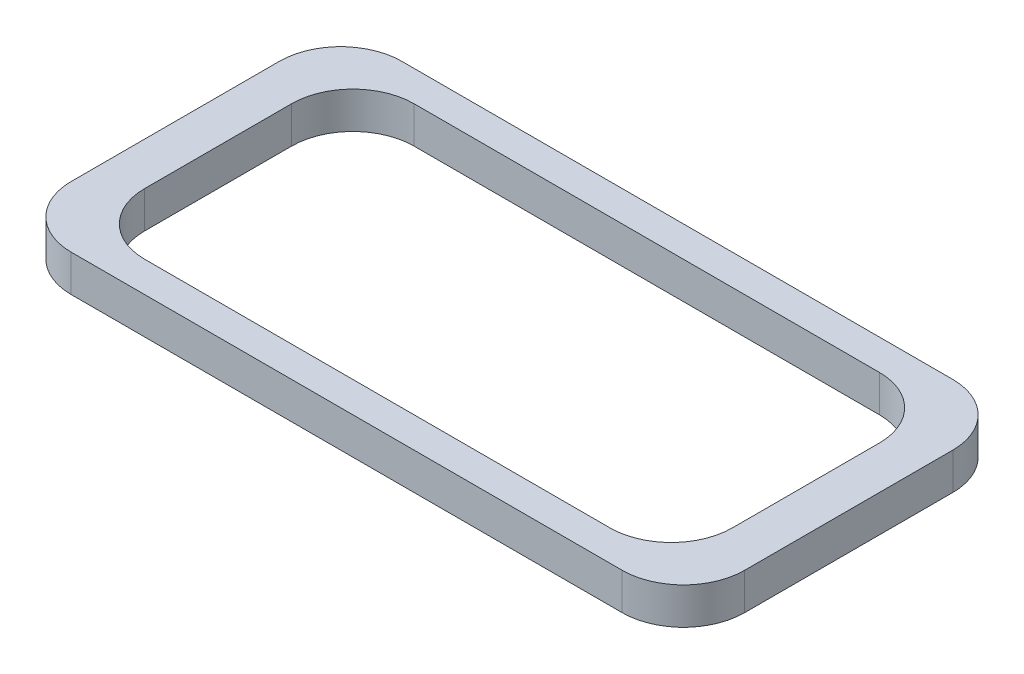
ISO-10303-21;
HEADER;
FILE_DESCRIPTION(('STEP AP214'),'2;1');
FILE_NAME('part.step','',(''),(''),'','','');
FILE_SCHEMA(('AUTOMOTIVE_DESIGN { 1 0 10303 214 1 1 1 1 }'));
ENDSEC;
DATA;
#1=APPLICATION_CONTEXT('core data for automotive mechanical design processes');
#2=APPLICATION_PROTOCOL_DEFINITION('international standard','automotive_design',2000,#1);
#3=PRODUCT_CONTEXT('',#1,'mechanical');
#4=PRODUCT('Part','Part','',(#3));
#5=PRODUCT_RELATED_PRODUCT_CATEGORY('part','',(#4));
#6=PRODUCT_DEFINITION_FORMATION('','',#4);
#7=PRODUCT_DEFINITION_CONTEXT('part definition',#1,'design');
#8=PRODUCT_DEFINITION('design','',#6,#7);
#9=PRODUCT_DEFINITION_SHAPE('','',#8);
#10=(LENGTH_UNIT() NAMED_UNIT(*) SI_UNIT(.MILLI.,.METRE.));
#11=(NAMED_UNIT(*) PLANE_ANGLE_UNIT() SI_UNIT($,.RADIAN.));
#12=(NAMED_UNIT(*) SI_UNIT($,.STERADIAN.) SOLID_ANGLE_UNIT());
#13=UNCERTAINTY_MEASURE_WITH_UNIT(LENGTH_MEASURE(1.E-05),#10,'distance_accuracy_value','');
#14=(GEOMETRIC_REPRESENTATION_CONTEXT(3) GLOBAL_UNCERTAINTY_ASSIGNED_CONTEXT((#13)) GLOBAL_UNIT_ASSIGNED_CONTEXT((#10,
#11,#12)) REPRESENTATION_CONTEXT('',''));
#15=CARTESIAN_POINT('',(0.,0.,0.));
#16=DIRECTION('',(0.,0.,1.));
#17=DIRECTION('',(1.,0.,0.));
#18=AXIS2_PLACEMENT_3D('',#15,#16,#17);
#19=CARTESIAN_POINT('',(22.5,3.,8.5));
#20=DIRECTION('',(0.,1.,0.));
#21=DIRECTION('',(0.,0.,1.));
#22=AXIS2_PLACEMENT_3D('',#19,#20,#21);
#23=PLANE('',#22);
#24=CARTESIAN_POINT('',(22.5,3.,8.5));
#25=DIRECTION('',(0.,1.,0.));
#26=DIRECTION('',(0.,0.,1.));
#27=AXIS2_PLACEMENT_3D('',#24,#25,#26);
#28=CIRCLE('',#27,5.);
#29=CARTESIAN_POINT('',(22.5,3.,13.5));
#30=VERTEX_POINT('',#29);
#31=CARTESIAN_POINT('',(27.5,3.,8.5));
#32=VERTEX_POINT('',#31);
#33=EDGE_CURVE('E215',#30,#32,#28,.T.);
#34=ORIENTED_EDGE('',*,*,#33,.T.);
#35=DIRECTION('',(0.,0.,-1.));
#36=VECTOR('',#35,1.);
#37=CARTESIAN_POINT('',(27.5,3.,-8.5));
#38=LINE('',#37,#36);
#39=CARTESIAN_POINT('',(27.5,3.,-8.5));
#40=VERTEX_POINT('',#39);
#41=EDGE_CURVE('E218',#32,#40,#38,.T.);
#42=ORIENTED_EDGE('',*,*,#41,.T.);
#43=CARTESIAN_POINT('',(22.5,3.,-8.5));
#44=DIRECTION('',(0.,1.,0.));
#45=DIRECTION('',(0.,0.,-1.));
#46=AXIS2_PLACEMENT_3D('',#43,#44,#45);
#47=CIRCLE('',#46,5.);
#48=CARTESIAN_POINT('',(22.5,3.,-13.5));
#49=VERTEX_POINT('',#48);
#50=EDGE_CURVE('E221',#40,#49,#47,.T.);
#51=ORIENTED_EDGE('',*,*,#50,.T.);
#52=DIRECTION('',(-1.,0.,0.));
#53=VECTOR('',#52,1.);
#54=CARTESIAN_POINT('',(-22.5,3.,-13.5));
#55=LINE('',#54,#53);
#56=CARTESIAN_POINT('',(-22.5,3.,-13.5));
#57=VERTEX_POINT('',#56);
#58=EDGE_CURVE('E223',#49,#57,#55,.T.);
#59=ORIENTED_EDGE('',*,*,#58,.T.);
#60=CARTESIAN_POINT('',(-22.5,3.,-8.5));
#61=DIRECTION('',(0.,1.,0.));
#62=DIRECTION('',(0.,0.,1.));
#63=AXIS2_PLACEMENT_3D('',#60,#61,#62);
#64=CIRCLE('',#63,5.);
#65=CARTESIAN_POINT('',(-27.5,3.,-8.5));
#66=VERTEX_POINT('',#65);
#67=EDGE_CURVE('E225',#57,#66,#64,.T.);
#68=ORIENTED_EDGE('',*,*,#67,.T.);
#69=DIRECTION('',(0.,0.,1.));
#70=VECTOR('',#69,1.);
#71=CARTESIAN_POINT('',(-27.5,3.,-8.5));
#72=LINE('',#71,#70);
#73=CARTESIAN_POINT('',(-27.5,3.,8.5));
#74=VERTEX_POINT('',#73);
#75=EDGE_CURVE('E227',#66,#74,#72,.T.);
#76=ORIENTED_EDGE('',*,*,#75,.T.);
#77=CARTESIAN_POINT('',(-22.5,3.,8.5));
#78=DIRECTION('',(0.,1.,0.));
#79=DIRECTION('',(0.,0.,1.));
#80=AXIS2_PLACEMENT_3D('',#77,#78,#79);
#81=CIRCLE('',#80,5.);
#82=CARTESIAN_POINT('',(-22.5,3.,13.5));
#83=VERTEX_POINT('',#82);
#84=EDGE_CURVE('E229',#74,#83,#81,.T.);
#85=ORIENTED_EDGE('',*,*,#84,.T.);
#86=DIRECTION('',(1.,0.,0.));
#87=VECTOR('',#86,1.);
#88=CARTESIAN_POINT('',(-22.5,3.,13.5));
#89=LINE('',#88,#87);
#90=EDGE_CURVE('E231',#83,#30,#89,.T.);
#91=ORIENTED_EDGE('',*,*,#90,.T.);
#92=EDGE_LOOP('',(#34,#42,#51,#59,#68,#76,#85,#91));
#93=FACE_BOUND('',#92,.T.);
#94=DIRECTION('',(1.,0.,0.));
#95=VECTOR('',#94,1.);
#96=CARTESIAN_POINT('',(-19.,3.,11.));
#97=LINE('',#96,#95);
#98=CARTESIAN_POINT('',(-19.,3.,11.));
#99=VERTEX_POINT('',#98);
#100=CARTESIAN_POINT('',(19.,3.,11.));
#101=VERTEX_POINT('',#100);
#102=EDGE_CURVE('E158',#99,#101,#97,.T.);
#103=ORIENTED_EDGE('',*,*,#102,.F.);
#104=CARTESIAN_POINT('',(-19.,3.,6.));
#105=DIRECTION('',(0.,1.,0.));
#106=DIRECTION('',(0.,0.,-1.));
#107=AXIS2_PLACEMENT_3D('',#104,#105,#106);
#108=CIRCLE('',#107,5.);
#109=CARTESIAN_POINT('',(-24.,3.,6.));
#110=VERTEX_POINT('',#109);
#111=EDGE_CURVE('E150',#110,#99,#108,.T.);
#112=ORIENTED_EDGE('',*,*,#111,.F.);
#113=DIRECTION('',(0.,0.,1.));
#114=VECTOR('',#113,1.);
#115=CARTESIAN_POINT('',(-24.,3.,6.));
#116=LINE('',#115,#114);
#117=CARTESIAN_POINT('',(-24.,3.,-6.));
#118=VERTEX_POINT('',#117);
#119=EDGE_CURVE('E183',#118,#110,#116,.T.);
#120=ORIENTED_EDGE('',*,*,#119,.F.);
#121=CARTESIAN_POINT('',(-19.,3.,-6.));
#122=DIRECTION('',(0.,1.,0.));
#123=DIRECTION('',(0.,0.,-1.));
#124=AXIS2_PLACEMENT_3D('',#121,#122,#123);
#125=CIRCLE('',#124,5.);
#126=CARTESIAN_POINT('',(-19.,3.,-11.));
#127=VERTEX_POINT('',#126);
#128=EDGE_CURVE('E181',#127,#118,#125,.T.);
#129=ORIENTED_EDGE('',*,*,#128,.F.);
#130=DIRECTION('',(-1.,0.,0.));
#131=VECTOR('',#130,1.);
#132=CARTESIAN_POINT('',(-19.,3.,-11.));
#133=LINE('',#132,#131);
#134=CARTESIAN_POINT('',(19.,3.,-11.));
#135=VERTEX_POINT('',#134);
#136=EDGE_CURVE('E179',#135,#127,#133,.T.);
#137=ORIENTED_EDGE('',*,*,#136,.F.);
#138=CARTESIAN_POINT('',(19.,3.,-6.));
#139=DIRECTION('',(0.,1.,0.));
#140=DIRECTION('',(0.,0.,-1.));
#141=AXIS2_PLACEMENT_3D('',#138,#139,#140);
#142=CIRCLE('',#141,5.);
#143=CARTESIAN_POINT('',(24.,3.,-6.));
#144=VERTEX_POINT('',#143);
#145=EDGE_CURVE('E177',#144,#135,#142,.T.);
#146=ORIENTED_EDGE('',*,*,#145,.F.);
#147=DIRECTION('',(0.,0.,-1.));
#148=VECTOR('',#147,1.);
#149=CARTESIAN_POINT('',(24.,3.,6.));
#150=LINE('',#149,#148);
#151=CARTESIAN_POINT('',(24.,3.,6.));
#152=VERTEX_POINT('',#151);
#153=EDGE_CURVE('E173',#152,#144,#150,.T.);
#154=ORIENTED_EDGE('',*,*,#153,.F.);
#155=CARTESIAN_POINT('',(19.,3.,6.));
#156=DIRECTION('',(0.,1.,0.));
#157=DIRECTION('',(0.,0.,1.));
#158=AXIS2_PLACEMENT_3D('',#155,#156,#157);
#159=CIRCLE('',#158,5.);
#160=EDGE_CURVE('E171',#101,#152,#159,.T.);
#161=ORIENTED_EDGE('',*,*,#160,.F.);
#162=EDGE_LOOP('',(#103,#112,#120,#129,#137,#146,#154,#161));
#163=FACE_BOUND('',#162,.T.);
#164=ADVANCED_FACE('F37',(#93,#163),#23,.T.);
#165=CARTESIAN_POINT('',(22.5,0.,8.5));
#166=DIRECTION('',(0.,1.,0.));
#167=DIRECTION('',(0.,0.,1.));
#168=AXIS2_PLACEMENT_3D('',#165,#166,#167);
#169=PLANE('',#168);
#170=CARTESIAN_POINT('',(22.5,0.,8.5));
#171=DIRECTION('',(0.,1.,0.));
#172=DIRECTION('',(0.,0.,1.));
#173=AXIS2_PLACEMENT_3D('',#170,#171,#172);
#174=CIRCLE('',#173,5.);
#175=CARTESIAN_POINT('',(22.5,0.,13.5));
#176=VERTEX_POINT('',#175);
#177=CARTESIAN_POINT('',(27.5,0.,8.5));
#178=VERTEX_POINT('',#177);
#179=EDGE_CURVE('E166',#176,#178,#174,.T.);
#180=ORIENTED_EDGE('',*,*,#179,.F.);
#181=DIRECTION('',(1.,0.,0.));
#182=VECTOR('',#181,1.);
#183=CARTESIAN_POINT('',(-22.5,0.,13.5));
#184=LINE('',#183,#182);
#185=CARTESIAN_POINT('',(-22.5,0.,13.5));
#186=VERTEX_POINT('',#185);
#187=EDGE_CURVE('E219',#186,#176,#184,.T.);
#188=ORIENTED_EDGE('',*,*,#187,.F.);
#189=CARTESIAN_POINT('',(-22.5,0.,8.5));
#190=DIRECTION('',(0.,1.,0.));
#191=DIRECTION('',(0.,0.,1.));
#192=AXIS2_PLACEMENT_3D('',#189,#190,#191);
#193=CIRCLE('',#192,5.);
#194=CARTESIAN_POINT('',(-27.5,0.,8.5));
#195=VERTEX_POINT('',#194);
#196=EDGE_CURVE('E246',#195,#186,#193,.T.);
#197=ORIENTED_EDGE('',*,*,#196,.F.);
#198=DIRECTION('',(0.,0.,1.));
#199=VECTOR('',#198,1.);
#200=CARTESIAN_POINT('',(-27.5,0.,-8.5));
#201=LINE('',#200,#199);
#202=CARTESIAN_POINT('',(-27.5,0.,-8.5));
#203=VERTEX_POINT('',#202);
#204=EDGE_CURVE('E244',#203,#195,#201,.T.);
#205=ORIENTED_EDGE('',*,*,#204,.F.);
#206=CARTESIAN_POINT('',(-22.5,0.,-8.5));
#207=DIRECTION('',(0.,1.,0.));
#208=DIRECTION('',(0.,0.,1.));
#209=AXIS2_PLACEMENT_3D('',#206,#207,#208);
#210=CIRCLE('',#209,5.);
#211=CARTESIAN_POINT('',(-22.5,0.,-13.5));
#212=VERTEX_POINT('',#211);
#213=EDGE_CURVE('E242',#212,#203,#210,.T.);
#214=ORIENTED_EDGE('',*,*,#213,.F.);
#215=DIRECTION('',(-1.,0.,0.));
#216=VECTOR('',#215,1.);
#217=CARTESIAN_POINT('',(-22.5,0.,-13.5));
#218=LINE('',#217,#216);
#219=CARTESIAN_POINT('',(22.5,0.,-13.5));
#220=VERTEX_POINT('',#219);
#221=EDGE_CURVE('E240',#220,#212,#218,.T.);
#222=ORIENTED_EDGE('',*,*,#221,.F.);
#223=CARTESIAN_POINT('',(22.5,0.,-8.5));
#224=DIRECTION('',(0.,1.,0.));
#225=DIRECTION('',(0.,0.,-1.));
#226=AXIS2_PLACEMENT_3D('',#223,#224,#225);
#227=CIRCLE('',#226,5.);
#228=CARTESIAN_POINT('',(27.5,0.,-8.5));
#229=VERTEX_POINT('',#228);
#230=EDGE_CURVE('E238',#229,#220,#227,.T.);
#231=ORIENTED_EDGE('',*,*,#230,.F.);
#232=DIRECTION('',(0.,0.,-1.));
#233=VECTOR('',#232,1.);
#234=CARTESIAN_POINT('',(27.5,0.,-8.5));
#235=LINE('',#234,#233);
#236=EDGE_CURVE('E236',#178,#229,#235,.T.);
#237=ORIENTED_EDGE('',*,*,#236,.F.);
#238=EDGE_LOOP('',(#180,#188,#197,#205,#214,#222,#231,#237));
#239=FACE_BOUND('',#238,.T.);
#240=CARTESIAN_POINT('',(-19.,0.,6.));
#241=DIRECTION('',(0.,1.,0.));
#242=DIRECTION('',(0.,0.,-1.));
#243=AXIS2_PLACEMENT_3D('',#240,#241,#242);
#244=CIRCLE('',#243,5.);
#245=CARTESIAN_POINT('',(-24.,0.,6.));
#246=VERTEX_POINT('',#245);
#247=CARTESIAN_POINT('',(-19.,0.,11.));
#248=VERTEX_POINT('',#247);
#249=EDGE_CURVE('E60',#246,#248,#244,.T.);
#250=ORIENTED_EDGE('',*,*,#249,.T.);
#251=DIRECTION('',(1.,0.,0.));
#252=VECTOR('',#251,1.);
#253=CARTESIAN_POINT('',(-19.,0.,11.));
#254=LINE('',#253,#252);
#255=CARTESIAN_POINT('',(19.,0.,11.));
#256=VERTEX_POINT('',#255);
#257=EDGE_CURVE('E165',#248,#256,#254,.T.);
#258=ORIENTED_EDGE('',*,*,#257,.T.);
#259=CARTESIAN_POINT('',(19.,0.,6.));
#260=DIRECTION('',(0.,1.,0.));
#261=DIRECTION('',(0.,0.,1.));
#262=AXIS2_PLACEMENT_3D('',#259,#260,#261);
#263=CIRCLE('',#262,5.);
#264=CARTESIAN_POINT('',(24.,0.,6.));
#265=VERTEX_POINT('',#264);
#266=EDGE_CURVE('E187',#256,#265,#263,.T.);
#267=ORIENTED_EDGE('',*,*,#266,.T.);
#268=DIRECTION('',(0.,0.,-1.));
#269=VECTOR('',#268,1.);
#270=CARTESIAN_POINT('',(24.,0.,6.));
#271=LINE('',#270,#269);
#272=CARTESIAN_POINT('',(24.,0.,-6.));
#273=VERTEX_POINT('',#272);
#274=EDGE_CURVE('E190',#265,#273,#271,.T.);
#275=ORIENTED_EDGE('',*,*,#274,.T.);
#276=CARTESIAN_POINT('',(19.,0.,-6.));
#277=DIRECTION('',(0.,1.,0.));
#278=DIRECTION('',(0.,0.,-1.));
#279=AXIS2_PLACEMENT_3D('',#276,#277,#278);
#280=CIRCLE('',#279,5.);
#281=CARTESIAN_POINT('',(19.,0.,-11.));
#282=VERTEX_POINT('',#281);
#283=EDGE_CURVE('E193',#273,#282,#280,.T.);
#284=ORIENTED_EDGE('',*,*,#283,.T.);
#285=DIRECTION('',(-1.,0.,0.));
#286=VECTOR('',#285,1.);
#287=CARTESIAN_POINT('',(-19.,0.,-11.));
#288=LINE('',#287,#286);
#289=CARTESIAN_POINT('',(-19.,0.,-11.));
#290=VERTEX_POINT('',#289);
#291=EDGE_CURVE('E196',#282,#290,#288,.T.);
#292=ORIENTED_EDGE('',*,*,#291,.T.);
#293=CARTESIAN_POINT('',(-19.,0.,-6.));
#294=DIRECTION('',(0.,1.,0.));
#295=DIRECTION('',(0.,0.,-1.));
#296=AXIS2_PLACEMENT_3D('',#293,#294,#295);
#297=CIRCLE('',#296,5.);
#298=CARTESIAN_POINT('',(-24.,0.,-6.));
#299=VERTEX_POINT('',#298);
#300=EDGE_CURVE('E199',#290,#299,#297,.T.);
#301=ORIENTED_EDGE('',*,*,#300,.T.);
#302=DIRECTION('',(0.,0.,1.));
#303=VECTOR('',#302,1.);
#304=CARTESIAN_POINT('',(-24.,0.,6.));
#305=LINE('',#304,#303);
#306=EDGE_CURVE('E159',#299,#246,#305,.T.);
#307=ORIENTED_EDGE('',*,*,#306,.T.);
#308=EDGE_LOOP('',(#250,#258,#267,#275,#284,#292,#301,#307));
#309=FACE_BOUND('',#308,.T.);
#310=ADVANCED_FACE('F276',(#239,#309),#169,.F.);
#311=CARTESIAN_POINT('',(22.5,3.,8.5));
#312=DIRECTION('',(0.,-1.,0.));
#313=DIRECTION('',(0.,0.,-1.));
#314=AXIS2_PLACEMENT_3D('',#311,#312,#313);
#315=CYLINDRICAL_SURFACE('',#314,5.);
#316=ORIENTED_EDGE('',*,*,#179,.T.);
#317=DIRECTION('',(0.,-1.,0.));
#318=VECTOR('',#317,1.);
#319=CARTESIAN_POINT('',(27.5,3.,8.5));
#320=LINE('',#319,#318);
#321=EDGE_CURVE('E11',#32,#178,#320,.T.);
#322=ORIENTED_EDGE('',*,*,#321,.F.);
#323=ORIENTED_EDGE('',*,*,#33,.F.);
#324=DIRECTION('',(0.,-1.,0.));
#325=VECTOR('',#324,1.);
#326=CARTESIAN_POINT('',(22.5,3.,13.5));
#327=LINE('',#326,#325);
#328=EDGE_CURVE('E233',#30,#176,#327,.T.);
#329=ORIENTED_EDGE('',*,*,#328,.T.);
#330=EDGE_LOOP('',(#316,#322,#323,#329));
#331=FACE_BOUND('',#330,.T.);
#332=ADVANCED_FACE('F39',(#331),#315,.T.);
#333=CARTESIAN_POINT('',(27.5,3.,-8.5));
#334=DIRECTION('',(-1.,0.,0.));
#335=DIRECTION('',(0.,0.,1.));
#336=AXIS2_PLACEMENT_3D('',#333,#334,#335);
#337=PLANE('',#336);
#338=ORIENTED_EDGE('',*,*,#236,.T.);
#339=DIRECTION('',(0.,-1.,0.));
#340=VECTOR('',#339,1.);
#341=CARTESIAN_POINT('',(27.5,3.,-8.5));
#342=LINE('',#341,#340);
#343=EDGE_CURVE('E45',#40,#229,#342,.T.);
#344=ORIENTED_EDGE('',*,*,#343,.F.);
#345=ORIENTED_EDGE('',*,*,#41,.F.);
#346=ORIENTED_EDGE('',*,*,#321,.T.);
#347=EDGE_LOOP('',(#338,#344,#345,#346));
#348=FACE_BOUND('',#347,.T.);
#349=ADVANCED_FACE('F293',(#348),#337,.F.);
#350=CARTESIAN_POINT('',(22.5,3.,-8.5));
#351=DIRECTION('',(0.,-1.,0.));
#352=DIRECTION('',(0.,0.,-1.));
#353=AXIS2_PLACEMENT_3D('',#350,#351,#352);
#354=CYLINDRICAL_SURFACE('',#353,5.);
#355=ORIENTED_EDGE('',*,*,#230,.T.);
#356=DIRECTION('',(0.,-1.,0.));
#357=VECTOR('',#356,1.);
#358=CARTESIAN_POINT('',(22.5,3.,-13.5));
#359=LINE('',#358,#357);
#360=EDGE_CURVE('E263',#49,#220,#359,.T.);
#361=ORIENTED_EDGE('',*,*,#360,.F.);
#362=ORIENTED_EDGE('',*,*,#50,.F.);
#363=ORIENTED_EDGE('',*,*,#343,.T.);
#364=EDGE_LOOP('',(#355,#361,#362,#363));
#365=FACE_BOUND('',#364,.T.);
#366=ADVANCED_FACE('F270',(#365),#354,.T.);
#367=CARTESIAN_POINT('',(-22.5,3.,-13.5));
#368=DIRECTION('',(0.,0.,1.));
#369=DIRECTION('',(1.,0.,0.));
#370=AXIS2_PLACEMENT_3D('',#367,#368,#369);
#371=PLANE('',#370);
#372=ORIENTED_EDGE('',*,*,#221,.T.);
#373=DIRECTION('',(0.,-1.,0.));
#374=VECTOR('',#373,1.);
#375=CARTESIAN_POINT('',(-22.5,3.,-13.5));
#376=LINE('',#375,#374);
#377=EDGE_CURVE('E260',#57,#212,#376,.T.);
#378=ORIENTED_EDGE('',*,*,#377,.F.);
#379=ORIENTED_EDGE('',*,*,#58,.F.);
#380=ORIENTED_EDGE('',*,*,#360,.T.);
#381=EDGE_LOOP('',(#372,#378,#379,#380));
#382=FACE_BOUND('',#381,.T.);
#383=ADVANCED_FACE('F282',(#382),#371,.F.);
#384=CARTESIAN_POINT('',(-22.5,3.,-8.5));
#385=DIRECTION('',(0.,-1.,0.));
#386=DIRECTION('',(0.,0.,-1.));
#387=AXIS2_PLACEMENT_3D('',#384,#385,#386);
#388=CYLINDRICAL_SURFACE('',#387,5.);
#389=ORIENTED_EDGE('',*,*,#213,.T.);
#390=DIRECTION('',(0.,-1.,0.));
#391=VECTOR('',#390,1.);
#392=CARTESIAN_POINT('',(-27.5,3.,-8.5));
#393=LINE('',#392,#391);
#394=EDGE_CURVE('E257',#66,#203,#393,.T.);
#395=ORIENTED_EDGE('',*,*,#394,.F.);
#396=ORIENTED_EDGE('',*,*,#67,.F.);
#397=ORIENTED_EDGE('',*,*,#377,.T.);
#398=EDGE_LOOP('',(#389,#395,#396,#397));
#399=FACE_BOUND('',#398,.T.);
#400=ADVANCED_FACE('F286',(#399),#388,.T.);
#401=CARTESIAN_POINT('',(-27.5,3.,-8.5));
#402=DIRECTION('',(1.,0.,0.));
#403=DIRECTION('',(0.,0.,-1.));
#404=AXIS2_PLACEMENT_3D('',#401,#402,#403);
#405=PLANE('',#404);
#406=ORIENTED_EDGE('',*,*,#204,.T.);
#407=DIRECTION('',(0.,-1.,0.));
#408=VECTOR('',#407,1.);
#409=CARTESIAN_POINT('',(-27.5,3.,8.5));
#410=LINE('',#409,#408);
#411=EDGE_CURVE('E254',#74,#195,#410,.T.);
#412=ORIENTED_EDGE('',*,*,#411,.F.);
#413=ORIENTED_EDGE('',*,*,#75,.F.);
#414=ORIENTED_EDGE('',*,*,#394,.T.);
#415=EDGE_LOOP('',(#406,#412,#413,#414));
#416=FACE_BOUND('',#415,.T.);
#417=ADVANCED_FACE('F306',(#416),#405,.F.);
#418=CARTESIAN_POINT('',(-22.5,3.,8.5));
#419=DIRECTION('',(0.,-1.,0.));
#420=DIRECTION('',(0.,0.,-1.));
#421=AXIS2_PLACEMENT_3D('',#418,#419,#420);
#422=CYLINDRICAL_SURFACE('',#421,5.);
#423=ORIENTED_EDGE('',*,*,#196,.T.);
#424=DIRECTION('',(0.,-1.,0.));
#425=VECTOR('',#424,1.);
#426=CARTESIAN_POINT('',(-22.5,3.,13.5));
#427=LINE('',#426,#425);
#428=EDGE_CURVE('E251',#83,#186,#427,.T.);
#429=ORIENTED_EDGE('',*,*,#428,.F.);
#430=ORIENTED_EDGE('',*,*,#84,.F.);
#431=ORIENTED_EDGE('',*,*,#411,.T.);
#432=EDGE_LOOP('',(#423,#429,#430,#431));
#433=FACE_BOUND('',#432,.T.);
#434=ADVANCED_FACE('F304',(#433),#422,.T.);
#435=CARTESIAN_POINT('',(-22.5,3.,13.5));
#436=DIRECTION('',(0.,0.,-1.));
#437=DIRECTION('',(-1.,0.,0.));
#438=AXIS2_PLACEMENT_3D('',#435,#436,#437);
#439=PLANE('',#438);
#440=ORIENTED_EDGE('',*,*,#187,.T.);
#441=ORIENTED_EDGE('',*,*,#328,.F.);
#442=ORIENTED_EDGE('',*,*,#90,.F.);
#443=ORIENTED_EDGE('',*,*,#428,.T.);
#444=EDGE_LOOP('',(#440,#441,#442,#443));
#445=FACE_BOUND('',#444,.T.);
#446=ADVANCED_FACE('F299',(#445),#439,.F.);
#447=CARTESIAN_POINT('',(-19.,3.,6.));
#448=DIRECTION('',(0.,-1.,0.));
#449=DIRECTION('',(0.,0.,-1.));
#450=AXIS2_PLACEMENT_3D('',#447,#448,#449);
#451=CYLINDRICAL_SURFACE('',#450,5.);
#452=ORIENTED_EDGE('',*,*,#249,.F.);
#453=DIRECTION('',(0.,-1.,0.));
#454=VECTOR('',#453,1.);
#455=CARTESIAN_POINT('',(-24.,3.,6.));
#456=LINE('',#455,#454);
#457=EDGE_CURVE('E154',#110,#246,#456,.T.);
#458=ORIENTED_EDGE('',*,*,#457,.F.);
#459=ORIENTED_EDGE('',*,*,#111,.T.);
#460=DIRECTION('',(0.,-1.,0.));
#461=VECTOR('',#460,1.);
#462=CARTESIAN_POINT('',(-19.,3.,11.));
#463=LINE('',#462,#461);
#464=EDGE_CURVE('E153',#99,#248,#463,.T.);
#465=ORIENTED_EDGE('',*,*,#464,.T.);
#466=EDGE_LOOP('',(#452,#458,#459,#465));
#467=FACE_BOUND('',#466,.T.);
#468=ADVANCED_FACE('F152',(#467),#451,.F.);
#469=CARTESIAN_POINT('',(-19.,3.,11.));
#470=DIRECTION('',(0.,0.,-1.));
#471=DIRECTION('',(-1.,0.,0.));
#472=AXIS2_PLACEMENT_3D('',#469,#470,#471);
#473=PLANE('',#472);
#474=ORIENTED_EDGE('',*,*,#257,.F.);
#475=ORIENTED_EDGE('',*,*,#464,.F.);
#476=ORIENTED_EDGE('',*,*,#102,.T.);
#477=DIRECTION('',(0.,-1.,0.));
#478=VECTOR('',#477,1.);
#479=CARTESIAN_POINT('',(19.,3.,11.));
#480=LINE('',#479,#478);
#481=EDGE_CURVE('E167',#101,#256,#480,.T.);
#482=ORIENTED_EDGE('',*,*,#481,.T.);
#483=EDGE_LOOP('',(#474,#475,#476,#482));
#484=FACE_BOUND('',#483,.T.);
#485=ADVANCED_FACE('F162',(#484),#473,.T.);
#486=CARTESIAN_POINT('',(19.,3.,6.));
#487=DIRECTION('',(0.,-1.,0.));
#488=DIRECTION('',(0.,0.,-1.));
#489=AXIS2_PLACEMENT_3D('',#486,#487,#488);
#490=CYLINDRICAL_SURFACE('',#489,5.);
#491=ORIENTED_EDGE('',*,*,#266,.F.);
#492=ORIENTED_EDGE('',*,*,#481,.F.);
#493=ORIENTED_EDGE('',*,*,#160,.T.);
#494=DIRECTION('',(0.,-1.,0.));
#495=VECTOR('',#494,1.);
#496=CARTESIAN_POINT('',(24.,3.,6.));
#497=LINE('',#496,#495);
#498=EDGE_CURVE('E212',#152,#265,#497,.T.);
#499=ORIENTED_EDGE('',*,*,#498,.T.);
#500=EDGE_LOOP('',(#491,#492,#493,#499));
#501=FACE_BOUND('',#500,.T.);
#502=ADVANCED_FACE('F331',(#501),#490,.F.);
#503=CARTESIAN_POINT('',(24.,3.,6.));
#504=DIRECTION('',(-1.,0.,0.));
#505=DIRECTION('',(0.,0.,1.));
#506=AXIS2_PLACEMENT_3D('',#503,#504,#505);
#507=PLANE('',#506);
#508=ORIENTED_EDGE('',*,*,#274,.F.);
#509=ORIENTED_EDGE('',*,*,#498,.F.);
#510=ORIENTED_EDGE('',*,*,#153,.T.);
#511=DIRECTION('',(0.,-1.,0.));
#512=VECTOR('',#511,1.);
#513=CARTESIAN_POINT('',(24.,3.,-6.));
#514=LINE('',#513,#512);
#515=EDGE_CURVE('E210',#144,#273,#514,.T.);
#516=ORIENTED_EDGE('',*,*,#515,.T.);
#517=EDGE_LOOP('',(#508,#509,#510,#516));
#518=FACE_BOUND('',#517,.T.);
#519=ADVANCED_FACE('F335',(#518),#507,.T.);
#520=CARTESIAN_POINT('',(19.,3.,-6.));
#521=DIRECTION('',(0.,-1.,0.));
#522=DIRECTION('',(0.,0.,-1.));
#523=AXIS2_PLACEMENT_3D('',#520,#521,#522);
#524=CYLINDRICAL_SURFACE('',#523,5.);
#525=ORIENTED_EDGE('',*,*,#283,.F.);
#526=ORIENTED_EDGE('',*,*,#515,.F.);
#527=ORIENTED_EDGE('',*,*,#145,.T.);
#528=DIRECTION('',(0.,-1.,0.));
#529=VECTOR('',#528,1.);
#530=CARTESIAN_POINT('',(19.,3.,-11.));
#531=LINE('',#530,#529);
#532=EDGE_CURVE('E208',#135,#282,#531,.T.);
#533=ORIENTED_EDGE('',*,*,#532,.T.);
#534=EDGE_LOOP('',(#525,#526,#527,#533));
#535=FACE_BOUND('',#534,.T.);
#536=ADVANCED_FACE('F341',(#535),#524,.F.);
#537=CARTESIAN_POINT('',(-19.,3.,-11.));
#538=DIRECTION('',(0.,0.,1.));
#539=DIRECTION('',(1.,0.,0.));
#540=AXIS2_PLACEMENT_3D('',#537,#538,#539);
#541=PLANE('',#540);
#542=ORIENTED_EDGE('',*,*,#291,.F.);
#543=ORIENTED_EDGE('',*,*,#532,.F.);
#544=ORIENTED_EDGE('',*,*,#136,.T.);
#545=DIRECTION('',(0.,-1.,0.));
#546=VECTOR('',#545,1.);
#547=CARTESIAN_POINT('',(-19.,3.,-11.));
#548=LINE('',#547,#546);
#549=EDGE_CURVE('E206',#127,#290,#548,.T.);
#550=ORIENTED_EDGE('',*,*,#549,.T.);
#551=EDGE_LOOP('',(#542,#543,#544,#550));
#552=FACE_BOUND('',#551,.T.);
#553=ADVANCED_FACE('F345',(#552),#541,.T.);
#554=CARTESIAN_POINT('',(-19.,3.,-6.));
#555=DIRECTION('',(0.,-1.,0.));
#556=DIRECTION('',(0.,0.,-1.));
#557=AXIS2_PLACEMENT_3D('',#554,#555,#556);
#558=CYLINDRICAL_SURFACE('',#557,5.);
#559=ORIENTED_EDGE('',*,*,#300,.F.);
#560=ORIENTED_EDGE('',*,*,#549,.F.);
#561=ORIENTED_EDGE('',*,*,#128,.T.);
#562=DIRECTION('',(0.,-1.,0.));
#563=VECTOR('',#562,1.);
#564=CARTESIAN_POINT('',(-24.,3.,-6.));
#565=LINE('',#564,#563);
#566=EDGE_CURVE('E52',#118,#299,#565,.T.);
#567=ORIENTED_EDGE('',*,*,#566,.T.);
#568=EDGE_LOOP('',(#559,#560,#561,#567));
#569=FACE_BOUND('',#568,.T.);
#570=ADVANCED_FACE('F349',(#569),#558,.F.);
#571=CARTESIAN_POINT('',(-24.,3.,6.));
#572=DIRECTION('',(1.,0.,0.));
#573=DIRECTION('',(0.,0.,-1.));
#574=AXIS2_PLACEMENT_3D('',#571,#572,#573);
#575=PLANE('',#574);
#576=ORIENTED_EDGE('',*,*,#306,.F.);
#577=ORIENTED_EDGE('',*,*,#566,.F.);
#578=ORIENTED_EDGE('',*,*,#119,.T.);
#579=ORIENTED_EDGE('',*,*,#457,.T.);
#580=EDGE_LOOP('',(#576,#577,#578,#579));
#581=FACE_BOUND('',#580,.T.);
#582=ADVANCED_FACE('F353',(#581),#575,.T.);
#583=CLOSED_SHELL('',(#164,#310,#332,#349,#366,#383,#400,#417,#434,#446,#468,#485,#502,#519,
#536,#553,#570,#582));
#584=MANIFOLD_SOLID_BREP('B2',#583);
#585=ADVANCED_BREP_SHAPE_REPRESENTATION('',(#18,#584),#14);
#586=SHAPE_DEFINITION_REPRESENTATION(#9,#585);
ENDSEC;
END-ISO-10303-21;
